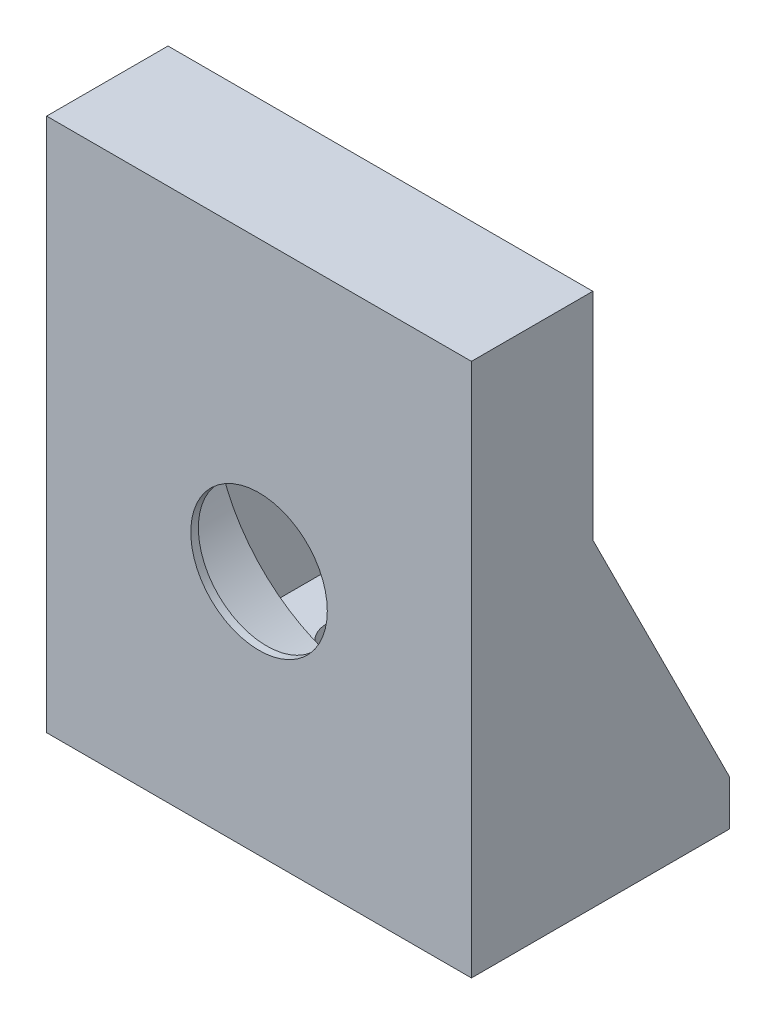
ISO-10303-21;
HEADER;
FILE_DESCRIPTION(('STEP AP214'),'2;1');
FILE_NAME('part.step','',(''),(''),'','','');
FILE_SCHEMA(('AUTOMOTIVE_DESIGN { 1 0 10303 214 1 1 1 1 }'));
ENDSEC;
DATA;
#1=APPLICATION_CONTEXT('core data for automotive mechanical design processes');
#2=APPLICATION_PROTOCOL_DEFINITION('international standard','automotive_design',2000,#1);
#3=PRODUCT_CONTEXT('',#1,'mechanical');
#4=PRODUCT('Part','Part','',(#3));
#5=PRODUCT_RELATED_PRODUCT_CATEGORY('part','',(#4));
#6=PRODUCT_DEFINITION_FORMATION('','',#4);
#7=PRODUCT_DEFINITION_CONTEXT('part definition',#1,'design');
#8=PRODUCT_DEFINITION('design','',#6,#7);
#9=PRODUCT_DEFINITION_SHAPE('','',#8);
#10=(LENGTH_UNIT() NAMED_UNIT(*) SI_UNIT(.MILLI.,.METRE.));
#11=(NAMED_UNIT(*) PLANE_ANGLE_UNIT() SI_UNIT($,.RADIAN.));
#12=(NAMED_UNIT(*) SI_UNIT($,.STERADIAN.) SOLID_ANGLE_UNIT());
#13=UNCERTAINTY_MEASURE_WITH_UNIT(LENGTH_MEASURE(1.E-05),#10,'distance_accuracy_value','');
#14=(GEOMETRIC_REPRESENTATION_CONTEXT(3) GLOBAL_UNCERTAINTY_ASSIGNED_CONTEXT((#13)) GLOBAL_UNIT_ASSIGNED_CONTEXT((#10,
#11,#12)) REPRESENTATION_CONTEXT('',''));
#15=CARTESIAN_POINT('',(0.,0.,0.));
#16=DIRECTION('',(0.,0.,1.));
#17=DIRECTION('',(1.,0.,0.));
#18=AXIS2_PLACEMENT_3D('',#15,#16,#17);
#19=CARTESIAN_POINT('',(-78.7321078244726,18.0359502095307,-10.5384479859829));
#20=DIRECTION('',(0.,0.,1.));
#21=DIRECTION('',(1.,0.,0.));
#22=AXIS2_PLACEMENT_3D('',#19,#20,#21);
#23=CYLINDRICAL_SURFACE('',#22,10.9999999999998);
#24=CARTESIAN_POINT('',(-78.7321078244726,18.0359502095307,-10.5384479859829));
#25=DIRECTION('',(0.,0.,1.));
#26=DIRECTION('',(1.,0.,0.));
#27=AXIS2_PLACEMENT_3D('',#24,#25,#26);
#28=CIRCLE('',#27,10.9999999999998);
#29=CARTESIAN_POINT('',(-89.7321078244726,18.0359502095307,-10.5384479859829));
#30=VERTEX_POINT('',#29);
#31=CARTESIAN_POINT('',(-67.7321078244728,18.0359502095307,-10.5384479859829));
#32=VERTEX_POINT('',#31);
#33=EDGE_CURVE('E170',#30,#32,#28,.T.);
#34=ORIENTED_EDGE('',*,*,#33,.F.);
#35=EDGE_CURVE('E173',#32,#30,#28,.T.);
#36=ORIENTED_EDGE('',*,*,#35,.F.);
#37=EDGE_LOOP('',(#34,#36));
#38=FACE_BOUND('',#37,.T.);
#39=CARTESIAN_POINT('',(-78.7321078244726,18.0359502095307,-3.03844798598293));
#40=DIRECTION('',(0.,0.,1.));
#41=DIRECTION('',(1.,0.,0.));
#42=AXIS2_PLACEMENT_3D('',#39,#40,#41);
#43=CIRCLE('',#42,10.9999999999998);
#44=CARTESIAN_POINT('',(-67.7321078244728,18.0359502095307,-3.03844798598293));
#45=VERTEX_POINT('',#44);
#46=EDGE_CURVE('E11',#45,#45,#43,.F.);
#47=ORIENTED_EDGE('',*,*,#46,.F.);
#48=EDGE_LOOP('',(#47));
#49=FACE_BOUND('',#48,.T.);
#50=ADVANCED_FACE('F35',(#38,#49),#23,.F.);
#51=CARTESIAN_POINT('',(0.,0.,-10.5384479859829));
#52=DIRECTION('',(0.,0.,1.));
#53=DIRECTION('',(1.,0.,0.));
#54=AXIS2_PLACEMENT_3D('',#51,#52,#53);
#55=PLANE('',#54);
#56=DIRECTION('',(0.,-1.,0.));
#57=VECTOR('',#56,1.);
#58=CARTESIAN_POINT('',(-67.7321078244726,0.,-10.5384479859829));
#59=LINE('',#58,#57);
#60=CARTESIAN_POINT('',(-67.7321078244726,4.83595020952913,-10.5384479859829));
#61=VERTEX_POINT('',#60);
#62=EDGE_CURVE('E57',#32,#61,#59,.T.);
#63=ORIENTED_EDGE('',*,*,#62,.T.);
#64=DIRECTION('',(-1.,0.,0.));
#65=VECTOR('',#64,1.);
#66=CARTESIAN_POINT('',(-55.2452748439675,4.83595020952913,-10.5384479859829));
#67=LINE('',#66,#65);
#68=CARTESIAN_POINT('',(-89.7321078244726,4.83595020952913,-10.5384479859829));
#69=VERTEX_POINT('',#68);
#70=EDGE_CURVE('E129',#61,#69,#67,.T.);
#71=ORIENTED_EDGE('',*,*,#70,.T.);
#72=DIRECTION('',(0.,-1.,0.));
#73=VECTOR('',#72,1.);
#74=CARTESIAN_POINT('',(-89.7321078244726,0.,-10.5384479859829));
#75=LINE('',#74,#73);
#76=EDGE_CURVE('E154',#30,#69,#75,.T.);
#77=ORIENTED_EDGE('',*,*,#76,.F.);
#78=ORIENTED_EDGE('',*,*,#33,.T.);
#79=EDGE_LOOP('',(#63,#71,#77,#78));
#80=FACE_BOUND('',#79,.T.);
#81=ADVANCED_FACE('F226',(#80),#55,.F.);
#82=CARTESIAN_POINT('',(-55.2452748439675,4.83595020952913,0.));
#83=DIRECTION('',(0.,-1.,0.));
#84=DIRECTION('',(0.,0.,-1.));
#85=AXIS2_PLACEMENT_3D('',#82,#83,#84);
#86=PLANE('',#85);
#87=CARTESIAN_POINT('',(-72.7321078244726,4.83595020952913,-15.0384479859829));
#88=DIRECTION('',(0.,1.,0.));
#89=DIRECTION('',(0.,0.,1.));
#90=AXIS2_PLACEMENT_3D('',#87,#88,#89);
#91=CIRCLE('',#90,2.);
#92=CARTESIAN_POINT('',(-72.7321078244726,4.83595020952913,-13.0384479859829));
#93=VERTEX_POINT('',#92);
#94=EDGE_CURVE('E268',#93,#93,#91,.T.);
#95=ORIENTED_EDGE('',*,*,#94,.F.);
#96=EDGE_LOOP('',(#95));
#97=FACE_BOUND('',#96,.T.);
#98=CARTESIAN_POINT('',(-84.7321078244726,4.83595020952913,-15.0384479859829));
#99=DIRECTION('',(0.,1.,0.));
#100=DIRECTION('',(0.,0.,-1.));
#101=AXIS2_PLACEMENT_3D('',#98,#99,#100);
#102=CIRCLE('',#101,2.);
#103=CARTESIAN_POINT('',(-84.7321078244726,4.83595020952913,-17.0384479859829));
#104=VERTEX_POINT('',#103);
#105=EDGE_CURVE('E269',#104,#104,#102,.T.);
#106=ORIENTED_EDGE('',*,*,#105,.F.);
#107=EDGE_LOOP('',(#106));
#108=FACE_BOUND('',#107,.T.);
#109=DIRECTION('',(0.,0.,1.));
#110=VECTOR('',#109,1.);
#111=CARTESIAN_POINT('',(-67.7321078244726,4.83595020952913,-10.5384479859829));
#112=LINE('',#111,#110);
#113=CARTESIAN_POINT('',(-67.7321078244726,4.83595020952913,-19.5384479859829));
#114=VERTEX_POINT('',#113);
#115=EDGE_CURVE('E127',#114,#61,#112,.T.);
#116=ORIENTED_EDGE('',*,*,#115,.F.);
#117=DIRECTION('',(-1.,0.,0.));
#118=VECTOR('',#117,1.);
#119=CARTESIAN_POINT('',(-55.2452748439675,4.83595020952913,-19.5384479859829));
#120=LINE('',#119,#118);
#121=CARTESIAN_POINT('',(-89.7321078244726,4.83595020952913,-19.5384479859829));
#122=VERTEX_POINT('',#121);
#123=EDGE_CURVE('E112',#114,#122,#120,.T.);
#124=ORIENTED_EDGE('',*,*,#123,.T.);
#125=DIRECTION('',(0.,0.,1.));
#126=VECTOR('',#125,1.);
#127=CARTESIAN_POINT('',(-89.7321078244726,4.83595020952913,0.));
#128=LINE('',#127,#126);
#129=EDGE_CURVE('E152',#122,#69,#128,.T.);
#130=ORIENTED_EDGE('',*,*,#129,.T.);
#131=ORIENTED_EDGE('',*,*,#70,.F.);
#132=EDGE_LOOP('',(#116,#124,#130,#131));
#133=FACE_BOUND('',#132,.T.);
#134=ADVANCED_FACE('F128',(#97,#108,#133),#86,.F.);
#135=DIRECTION('',(0.,-1.,0.));
#136=VECTOR('',#135,1.);
#137=CARTESIAN_POINT('',(-64.7321078244726,0.,-10.5384479859829));
#138=LINE('',#137,#136);
#139=CARTESIAN_POINT('',(-64.7321078244726,37.0359502095306,-10.5384479859829));
#140=VERTEX_POINT('',#139);
#141=CARTESIAN_POINT('',(-64.7321078244726,22.8359502095292,-10.5384479859829));
#142=VERTEX_POINT('',#141);
#143=EDGE_CURVE('E172',#140,#142,#138,.T.);
#144=ORIENTED_EDGE('',*,*,#143,.T.);
#145=DIRECTION('',(1.,0.,0.));
#146=VECTOR('',#145,1.);
#147=CARTESIAN_POINT('',(-67.7321078244726,22.8359502095292,-10.5384479859829));
#148=LINE('',#147,#146);
#149=CARTESIAN_POINT('',(-67.7321078244726,22.8359502095292,-10.5384479859829));
#150=VERTEX_POINT('',#149);
#151=EDGE_CURVE('E49',#150,#142,#148,.T.);
#152=ORIENTED_EDGE('',*,*,#151,.F.);
#153=EDGE_CURVE('E141',#150,#32,#59,.T.);
#154=ORIENTED_EDGE('',*,*,#153,.T.);
#155=ORIENTED_EDGE('',*,*,#35,.T.);
#156=CARTESIAN_POINT('',(-89.7321078244726,22.8359502095292,-10.5384479859829));
#157=VERTEX_POINT('',#156);
#158=EDGE_CURVE('E155',#157,#30,#75,.T.);
#159=ORIENTED_EDGE('',*,*,#158,.F.);
#160=DIRECTION('',(-1.,0.,0.));
#161=VECTOR('',#160,1.);
#162=CARTESIAN_POINT('',(-89.7321078244726,22.8359502095292,-10.5384479859829));
#163=LINE('',#162,#161);
#164=CARTESIAN_POINT('',(-92.7321078244726,22.8359502095292,-10.5384479859829));
#165=VERTEX_POINT('',#164);
#166=EDGE_CURVE('E160',#157,#165,#163,.T.);
#167=ORIENTED_EDGE('',*,*,#166,.T.);
#168=DIRECTION('',(0.,-1.,0.));
#169=VECTOR('',#168,1.);
#170=CARTESIAN_POINT('',(-92.7321078244726,0.,-10.5384479859829));
#171=LINE('',#170,#169);
#172=CARTESIAN_POINT('',(-92.7321078244726,37.0359502095306,-10.5384479859829));
#173=VERTEX_POINT('',#172);
#174=EDGE_CURVE('E177',#173,#165,#171,.T.);
#175=ORIENTED_EDGE('',*,*,#174,.F.);
#176=DIRECTION('',(1.,0.,0.));
#177=VECTOR('',#176,1.);
#178=CARTESIAN_POINT('',(0.,37.0359502095306,-10.5384479859829));
#179=LINE('',#178,#177);
#180=EDGE_CURVE('E175',#173,#140,#179,.T.);
#181=ORIENTED_EDGE('',*,*,#180,.T.);
#182=EDGE_LOOP('',(#144,#152,#154,#155,#159,#167,#175,#181));
#183=FACE_BOUND('',#182,.T.);
#184=ADVANCED_FACE('F230',(#183),#55,.F.);
#185=CARTESIAN_POINT('',(-64.7321078244726,0.,-10.5384479859829));
#186=DIRECTION('',(-1.,0.,0.));
#187=DIRECTION('',(0.,0.,1.));
#188=AXIS2_PLACEMENT_3D('',#185,#186,#187);
#189=PLANE('',#188);
#190=DIRECTION('',(0.,-1.,0.));
#191=VECTOR('',#190,1.);
#192=CARTESIAN_POINT('',(-64.7321078244726,0.,-19.5384479859829));
#193=LINE('',#192,#191);
#194=CARTESIAN_POINT('',(-64.7321078244726,4.83595020952913,-19.5384479859829));
#195=VERTEX_POINT('',#194);
#196=CARTESIAN_POINT('',(-64.7321078244726,1.83595020952913,-19.5384479859829));
#197=VERTEX_POINT('',#196);
#198=EDGE_CURVE('E165',#195,#197,#193,.T.);
#199=ORIENTED_EDGE('',*,*,#198,.F.);
#200=DIRECTION('',(0.,0.894427190999916,0.447213595499958));
#201=VECTOR('',#200,1.);
#202=CARTESIAN_POINT('',(-64.7321078244726,4.56719004190583,-19.6728280697946));
#203=LINE('',#202,#201);
#204=EDGE_CURVE('E132',#195,#142,#203,.T.);
#205=ORIENTED_EDGE('',*,*,#204,.T.);
#206=ORIENTED_EDGE('',*,*,#143,.F.);
#207=DIRECTION('',(0.,0.,1.));
#208=VECTOR('',#207,1.);
#209=CARTESIAN_POINT('',(-64.7321078244726,37.0359502095306,-10.5384479859829));
#210=LINE('',#209,#208);
#211=CARTESIAN_POINT('',(-64.7321078244726,37.0359502095306,-2.53844798598293));
#212=VERTEX_POINT('',#211);
#213=EDGE_CURVE('E180',#140,#212,#210,.T.);
#214=ORIENTED_EDGE('',*,*,#213,.T.);
#215=DIRECTION('',(0.,-1.,0.));
#216=VECTOR('',#215,1.);
#217=CARTESIAN_POINT('',(-64.7321078244726,0.,-2.53844798598293));
#218=LINE('',#217,#216);
#219=CARTESIAN_POINT('',(-64.7321078244726,1.83595020952914,-2.53844798598293));
#220=VERTEX_POINT('',#219);
#221=EDGE_CURVE('E169',#212,#220,#218,.T.);
#222=ORIENTED_EDGE('',*,*,#221,.T.);
#223=DIRECTION('',(0.,0.,1.));
#224=VECTOR('',#223,1.);
#225=CARTESIAN_POINT('',(-64.7321078244726,1.83595020952914,-10.5384479859829));
#226=LINE('',#225,#224);
#227=EDGE_CURVE('E42',#197,#220,#226,.T.);
#228=ORIENTED_EDGE('',*,*,#227,.F.);
#229=EDGE_LOOP('',(#199,#205,#206,#214,#222,#228));
#230=FACE_BOUND('',#229,.T.);
#231=ADVANCED_FACE('F200',(#230),#189,.F.);
#232=CARTESIAN_POINT('',(0.,1.83595020952914,-10.5384479859829));
#233=DIRECTION('',(0.,-1.,0.));
#234=DIRECTION('',(1.,0.,0.));
#235=AXIS2_PLACEMENT_3D('',#232,#233,#234);
#236=PLANE('',#235);
#237=CARTESIAN_POINT('',(-72.7321078244726,1.83595020952913,-15.0384479859829));
#238=DIRECTION('',(0.,1.,0.));
#239=DIRECTION('',(0.,0.,1.));
#240=AXIS2_PLACEMENT_3D('',#237,#238,#239);
#241=CIRCLE('',#240,2.);
#242=CARTESIAN_POINT('',(-72.7321078244726,1.83595020952913,-13.0384479859829));
#243=VERTEX_POINT('',#242);
#244=EDGE_CURVE('E147',#243,#243,#241,.T.);
#245=ORIENTED_EDGE('',*,*,#244,.T.);
#246=EDGE_LOOP('',(#245));
#247=FACE_BOUND('',#246,.T.);
#248=CARTESIAN_POINT('',(-84.7321078244726,1.83595020952913,-15.0384479859829));
#249=DIRECTION('',(0.,1.,0.));
#250=DIRECTION('',(0.,0.,-1.));
#251=AXIS2_PLACEMENT_3D('',#248,#249,#250);
#252=CIRCLE('',#251,2.);
#253=CARTESIAN_POINT('',(-84.7321078244726,1.83595020952913,-17.0384479859829));
#254=VERTEX_POINT('',#253);
#255=EDGE_CURVE('E266',#254,#254,#252,.T.);
#256=ORIENTED_EDGE('',*,*,#255,.T.);
#257=EDGE_LOOP('',(#256));
#258=FACE_BOUND('',#257,.T.);
#259=DIRECTION('',(1.,0.,0.));
#260=VECTOR('',#259,1.);
#261=CARTESIAN_POINT('',(0.,1.83595020952914,-2.53844798598293));
#262=LINE('',#261,#260);
#263=CARTESIAN_POINT('',(-92.7321078244726,1.83595020952913,-2.53844798598293));
#264=VERTEX_POINT('',#263);
#265=EDGE_CURVE('E188',#264,#220,#262,.T.);
#266=ORIENTED_EDGE('',*,*,#265,.F.);
#267=DIRECTION('',(0.,0.,1.));
#268=VECTOR('',#267,1.);
#269=CARTESIAN_POINT('',(-92.7321078244726,1.83595020952913,-10.5384479859829));
#270=LINE('',#269,#268);
#271=CARTESIAN_POINT('',(-92.7321078244726,1.83595020952913,-19.5384479859829));
#272=VERTEX_POINT('',#271);
#273=EDGE_CURVE('E192',#272,#264,#270,.T.);
#274=ORIENTED_EDGE('',*,*,#273,.F.);
#275=DIRECTION('',(-1.,0.,0.));
#276=VECTOR('',#275,1.);
#277=CARTESIAN_POINT('',(-55.2452748439675,1.83595020952913,-19.5384479859829));
#278=LINE('',#277,#276);
#279=EDGE_CURVE('E139',#197,#272,#278,.T.);
#280=ORIENTED_EDGE('',*,*,#279,.F.);
#281=ORIENTED_EDGE('',*,*,#227,.T.);
#282=EDGE_LOOP('',(#266,#274,#280,#281));
#283=FACE_BOUND('',#282,.T.);
#284=ADVANCED_FACE('F210',(#247,#258,#283),#236,.T.);
#285=CARTESIAN_POINT('',(-92.7321078244726,0.,-10.5384479859829));
#286=DIRECTION('',(-1.,0.,0.));
#287=DIRECTION('',(0.,0.,1.));
#288=AXIS2_PLACEMENT_3D('',#285,#286,#287);
#289=PLANE('',#288);
#290=DIRECTION('',(0.,-1.,0.));
#291=VECTOR('',#290,1.);
#292=CARTESIAN_POINT('',(-92.7321078244726,0.,-2.53844798598293));
#293=LINE('',#292,#291);
#294=CARTESIAN_POINT('',(-92.7321078244726,37.0359502095306,-2.53844798598293));
#295=VERTEX_POINT('',#294);
#296=EDGE_CURVE('E185',#295,#264,#293,.T.);
#297=ORIENTED_EDGE('',*,*,#296,.F.);
#298=DIRECTION('',(0.,0.,1.));
#299=VECTOR('',#298,1.);
#300=CARTESIAN_POINT('',(-92.7321078244726,37.0359502095306,-10.5384479859829));
#301=LINE('',#300,#299);
#302=EDGE_CURVE('E194',#173,#295,#301,.T.);
#303=ORIENTED_EDGE('',*,*,#302,.F.);
#304=ORIENTED_EDGE('',*,*,#174,.T.);
#305=DIRECTION('',(0.,0.894427190999916,0.447213595499958));
#306=VECTOR('',#305,1.);
#307=CARTESIAN_POINT('',(-92.7321078244726,8.78256923629901,-17.565138472598));
#308=LINE('',#307,#306);
#309=CARTESIAN_POINT('',(-92.7321078244726,4.83595020952913,-19.5384479859829));
#310=VERTEX_POINT('',#309);
#311=EDGE_CURVE('E143',#310,#165,#308,.T.);
#312=ORIENTED_EDGE('',*,*,#311,.F.);
#313=DIRECTION('',(0.,1.,0.));
#314=VECTOR('',#313,1.);
#315=CARTESIAN_POINT('',(-92.7321078244726,0.,-19.5384479859829));
#316=LINE('',#315,#314);
#317=EDGE_CURVE('E124',#272,#310,#316,.T.);
#318=ORIENTED_EDGE('',*,*,#317,.F.);
#319=ORIENTED_EDGE('',*,*,#273,.T.);
#320=EDGE_LOOP('',(#297,#303,#304,#312,#318,#319));
#321=FACE_BOUND('',#320,.T.);
#322=ADVANCED_FACE('F215',(#321),#289,.T.);
#323=CARTESIAN_POINT('',(0.,37.0359502095306,-10.5384479859829));
#324=DIRECTION('',(0.,-1.,0.));
#325=DIRECTION('',(0.,0.,-1.));
#326=AXIS2_PLACEMENT_3D('',#323,#324,#325);
#327=PLANE('',#326);
#328=DIRECTION('',(1.,0.,0.));
#329=VECTOR('',#328,1.);
#330=CARTESIAN_POINT('',(0.,37.0359502095306,-2.53844798598293));
#331=LINE('',#330,#329);
#332=EDGE_CURVE('E183',#295,#212,#331,.T.);
#333=ORIENTED_EDGE('',*,*,#332,.T.);
#334=ORIENTED_EDGE('',*,*,#213,.F.);
#335=ORIENTED_EDGE('',*,*,#180,.F.);
#336=ORIENTED_EDGE('',*,*,#302,.T.);
#337=EDGE_LOOP('',(#333,#334,#335,#336));
#338=FACE_BOUND('',#337,.T.);
#339=ADVANCED_FACE('F231',(#338),#327,.F.);
#340=CARTESIAN_POINT('',(0.,0.,-2.53844798598293));
#341=DIRECTION('',(0.,0.,1.));
#342=DIRECTION('',(1.,0.,0.));
#343=AXIS2_PLACEMENT_3D('',#340,#341,#342);
#344=PLANE('',#343);
#345=ORIENTED_EDGE('',*,*,#221,.F.);
#346=ORIENTED_EDGE('',*,*,#332,.F.);
#347=ORIENTED_EDGE('',*,*,#296,.T.);
#348=ORIENTED_EDGE('',*,*,#265,.T.);
#349=EDGE_LOOP('',(#345,#346,#347,#348));
#350=FACE_BOUND('',#349,.T.);
#351=CARTESIAN_POINT('',(-78.7321078244726,18.0359502095307,-2.53844798598293));
#352=DIRECTION('',(0.,0.,1.));
#353=DIRECTION('',(1.,0.,0.));
#354=AXIS2_PLACEMENT_3D('',#351,#352,#353);
#355=CIRCLE('',#354,4.5);
#356=CARTESIAN_POINT('',(-74.2321078244726,18.0359502095307,-2.53844798598293));
#357=VERTEX_POINT('',#356);
#358=EDGE_CURVE('E278',#357,#357,#355,.T.);
#359=ORIENTED_EDGE('',*,*,#358,.F.);
#360=EDGE_LOOP('',(#359));
#361=FACE_BOUND('',#360,.T.);
#362=ADVANCED_FACE('F205',(#350,#361),#344,.T.);
#363=CARTESIAN_POINT('',(-55.2452748439675,0.,-19.5384479859829));
#364=DIRECTION('',(0.,0.,1.));
#365=DIRECTION('',(1.,0.,0.));
#366=AXIS2_PLACEMENT_3D('',#363,#364,#365);
#367=PLANE('',#366);
#368=EDGE_CURVE('E117',#195,#114,#120,.T.);
#369=ORIENTED_EDGE('',*,*,#368,.F.);
#370=ORIENTED_EDGE('',*,*,#198,.T.);
#371=ORIENTED_EDGE('',*,*,#279,.T.);
#372=ORIENTED_EDGE('',*,*,#317,.T.);
#373=DIRECTION('',(-1.,0.,0.));
#374=VECTOR('',#373,1.);
#375=CARTESIAN_POINT('',(-89.7321078244726,4.83595020952913,-19.5384479859829));
#376=LINE('',#375,#374);
#377=EDGE_CURVE('E120',#122,#310,#376,.T.);
#378=ORIENTED_EDGE('',*,*,#377,.F.);
#379=ORIENTED_EDGE('',*,*,#123,.F.);
#380=EDGE_LOOP('',(#369,#370,#371,#372,#378,#379));
#381=FACE_BOUND('',#380,.T.);
#382=ADVANCED_FACE('F114',(#381),#367,.F.);
#383=CARTESIAN_POINT('',(-89.7321078244726,8.78256923629901,-17.565138472598));
#384=DIRECTION('',(0.,-0.447213595499958,0.894427190999916));
#385=DIRECTION('',(0.,-0.894427190999916,-0.447213595499958));
#386=AXIS2_PLACEMENT_3D('',#383,#384,#385);
#387=PLANE('',#386);
#388=ORIENTED_EDGE('',*,*,#311,.T.);
#389=ORIENTED_EDGE('',*,*,#166,.F.);
#390=DIRECTION('',(0.,0.894427190999916,0.447213595499958));
#391=VECTOR('',#390,1.);
#392=CARTESIAN_POINT('',(-89.7321078244726,8.78256923629901,-17.565138472598));
#393=LINE('',#392,#391);
#394=EDGE_CURVE('E149',#122,#157,#393,.T.);
#395=ORIENTED_EDGE('',*,*,#394,.F.);
#396=ORIENTED_EDGE('',*,*,#377,.T.);
#397=EDGE_LOOP('',(#388,#389,#395,#396));
#398=FACE_BOUND('',#397,.T.);
#399=ADVANCED_FACE('F219',(#398),#387,.F.);
#400=CARTESIAN_POINT('',(-89.7321078244726,0.,0.));
#401=DIRECTION('',(-1.,0.,0.));
#402=DIRECTION('',(0.,0.,1.));
#403=AXIS2_PLACEMENT_3D('',#400,#401,#402);
#404=PLANE('',#403);
#405=ORIENTED_EDGE('',*,*,#394,.T.);
#406=ORIENTED_EDGE('',*,*,#158,.T.);
#407=ORIENTED_EDGE('',*,*,#76,.T.);
#408=ORIENTED_EDGE('',*,*,#129,.F.);
#409=EDGE_LOOP('',(#405,#406,#407,#408));
#410=FACE_BOUND('',#409,.T.);
#411=ADVANCED_FACE('F223',(#410),#404,.F.);
#412=CARTESIAN_POINT('',(-67.7321078244726,4.56719004190583,-19.6728280697946));
#413=DIRECTION('',(0.,0.447213595499958,-0.894427190999916));
#414=DIRECTION('',(0.,0.894427190999916,0.447213595499958));
#415=AXIS2_PLACEMENT_3D('',#412,#413,#414);
#416=PLANE('',#415);
#417=ORIENTED_EDGE('',*,*,#204,.F.);
#418=ORIENTED_EDGE('',*,*,#368,.T.);
#419=DIRECTION('',(0.,0.894427190999916,0.447213595499958));
#420=VECTOR('',#419,1.);
#421=CARTESIAN_POINT('',(-67.7321078244726,4.56719004190583,-19.6728280697946));
#422=LINE('',#421,#420);
#423=EDGE_CURVE('E137',#114,#150,#422,.T.);
#424=ORIENTED_EDGE('',*,*,#423,.T.);
#425=ORIENTED_EDGE('',*,*,#151,.T.);
#426=EDGE_LOOP('',(#417,#418,#424,#425));
#427=FACE_BOUND('',#426,.T.);
#428=ADVANCED_FACE('F136',(#427),#416,.T.);
#429=CARTESIAN_POINT('',(-67.7321078244726,0.,0.));
#430=DIRECTION('',(1.,0.,0.));
#431=DIRECTION('',(0.,0.,-1.));
#432=AXIS2_PLACEMENT_3D('',#429,#430,#431);
#433=PLANE('',#432);
#434=ORIENTED_EDGE('',*,*,#115,.T.);
#435=ORIENTED_EDGE('',*,*,#62,.F.);
#436=ORIENTED_EDGE('',*,*,#153,.F.);
#437=ORIENTED_EDGE('',*,*,#423,.F.);
#438=EDGE_LOOP('',(#434,#435,#436,#437));
#439=FACE_BOUND('',#438,.T.);
#440=ADVANCED_FACE('F140',(#439),#433,.F.);
#441=CARTESIAN_POINT('',(-84.7321078244726,1.83595020952913,-15.0384479859829));
#442=DIRECTION('',(0.,1.,0.));
#443=DIRECTION('',(0.,0.,1.));
#444=AXIS2_PLACEMENT_3D('',#441,#442,#443);
#445=CYLINDRICAL_SURFACE('',#444,2.);
#446=ORIENTED_EDGE('',*,*,#255,.F.);
#447=EDGE_LOOP('',(#446));
#448=FACE_BOUND('',#447,.T.);
#449=ORIENTED_EDGE('',*,*,#105,.T.);
#450=EDGE_LOOP('',(#449));
#451=FACE_BOUND('',#450,.T.);
#452=ADVANCED_FACE('F298',(#448,#451),#445,.F.);
#453=CARTESIAN_POINT('',(-72.7321078244726,1.83595020952913,-15.0384479859829));
#454=DIRECTION('',(0.,1.,0.));
#455=DIRECTION('',(0.,0.,1.));
#456=AXIS2_PLACEMENT_3D('',#453,#454,#455);
#457=CYLINDRICAL_SURFACE('',#456,2.);
#458=ORIENTED_EDGE('',*,*,#244,.F.);
#459=EDGE_LOOP('',(#458));
#460=FACE_BOUND('',#459,.T.);
#461=ORIENTED_EDGE('',*,*,#94,.T.);
#462=EDGE_LOOP('',(#461));
#463=FACE_BOUND('',#462,.T.);
#464=ADVANCED_FACE('F289',(#460,#463),#457,.F.);
#465=CARTESIAN_POINT('',(-78.7321078244726,18.0359502095307,-3.03844798598293));
#466=DIRECTION('',(0.,0.,1.));
#467=DIRECTION('',(1.,0.,0.));
#468=AXIS2_PLACEMENT_3D('',#465,#466,#467);
#469=CYLINDRICAL_SURFACE('',#468,4.5);
#470=CARTESIAN_POINT('',(-78.7321078244726,18.0359502095307,-3.03844798598293));
#471=DIRECTION('',(0.,0.,1.));
#472=DIRECTION('',(1.,0.,0.));
#473=AXIS2_PLACEMENT_3D('',#470,#471,#472);
#474=CIRCLE('',#473,4.5);
#475=CARTESIAN_POINT('',(-74.2321078244726,18.0359502095307,-3.03844798598293));
#476=VERTEX_POINT('',#475);
#477=EDGE_CURVE('E274',#476,#476,#474,.T.);
#478=ORIENTED_EDGE('',*,*,#477,.F.);
#479=EDGE_LOOP('',(#478));
#480=FACE_BOUND('',#479,.T.);
#481=ORIENTED_EDGE('',*,*,#358,.T.);
#482=EDGE_LOOP('',(#481));
#483=FACE_BOUND('',#482,.T.);
#484=ADVANCED_FACE('F286',(#480,#483),#469,.F.);
#485=CARTESIAN_POINT('',(0.,0.,-3.03844798598293));
#486=DIRECTION('',(0.,0.,1.));
#487=DIRECTION('',(1.,0.,0.));
#488=AXIS2_PLACEMENT_3D('',#485,#486,#487);
#489=PLANE('',#488);
#490=ORIENTED_EDGE('',*,*,#46,.T.);
#491=EDGE_LOOP('',(#490));
#492=FACE_BOUND('',#491,.T.);
#493=ORIENTED_EDGE('',*,*,#477,.T.);
#494=EDGE_LOOP('',(#493));
#495=FACE_BOUND('',#494,.T.);
#496=ADVANCED_FACE('F284',(#492,#495),#489,.F.);
#497=CLOSED_SHELL('',(#50,#81,#134,#184,#231,#284,#322,#339,#362,#382,#399,#411,#428,#440,#452,
#464,#484,#496));
#498=MANIFOLD_SOLID_BREP('B2',#497);
#499=ADVANCED_BREP_SHAPE_REPRESENTATION('',(#18,#498),#14);
#500=SHAPE_DEFINITION_REPRESENTATION(#9,#499);
ENDSEC;
END-ISO-10303-21;
